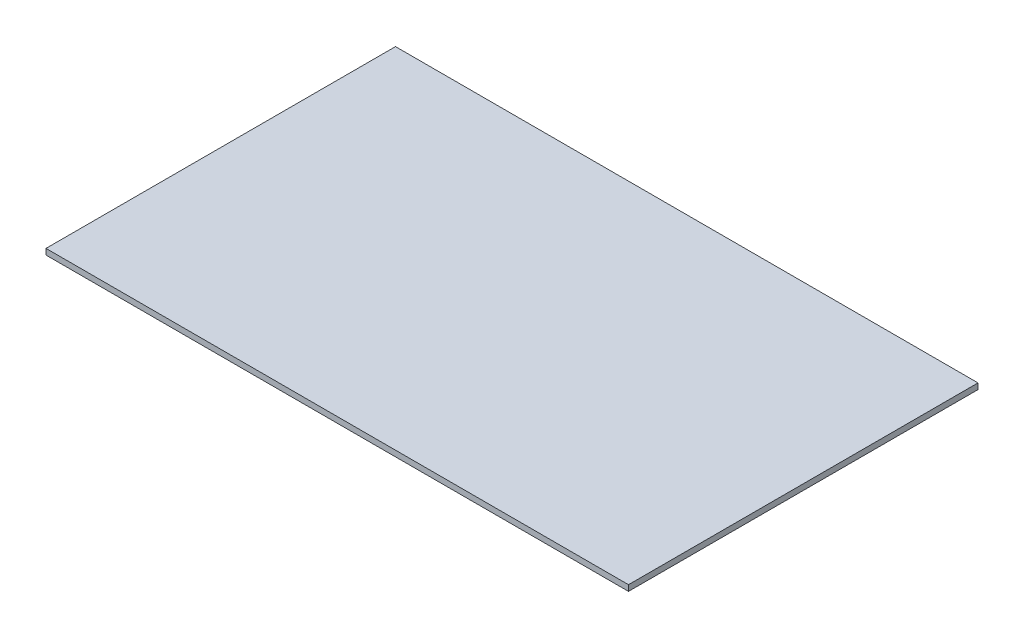
ISO-10303-21;
HEADER;
FILE_DESCRIPTION(('STEP AP214'),'2;1');
FILE_NAME('part.step','',(''),(''),'','','');
FILE_SCHEMA(('AUTOMOTIVE_DESIGN { 1 0 10303 214 1 1 1 1 }'));
ENDSEC;
DATA;
#1=APPLICATION_CONTEXT('core data for automotive mechanical design processes');
#2=APPLICATION_PROTOCOL_DEFINITION('international standard','automotive_design',2000,#1);
#3=PRODUCT_CONTEXT('',#1,'mechanical');
#4=PRODUCT('Part','Part','',(#3));
#5=PRODUCT_RELATED_PRODUCT_CATEGORY('part','',(#4));
#6=PRODUCT_DEFINITION_FORMATION('','',#4);
#7=PRODUCT_DEFINITION_CONTEXT('part definition',#1,'design');
#8=PRODUCT_DEFINITION('design','',#6,#7);
#9=PRODUCT_DEFINITION_SHAPE('','',#8);
#10=(LENGTH_UNIT() NAMED_UNIT(*) SI_UNIT(.MILLI.,.METRE.));
#11=(NAMED_UNIT(*) PLANE_ANGLE_UNIT() SI_UNIT($,.RADIAN.));
#12=(NAMED_UNIT(*) SI_UNIT($,.STERADIAN.) SOLID_ANGLE_UNIT());
#13=UNCERTAINTY_MEASURE_WITH_UNIT(LENGTH_MEASURE(1.E-05),#10,'distance_accuracy_value','');
#14=(GEOMETRIC_REPRESENTATION_CONTEXT(3) GLOBAL_UNCERTAINTY_ASSIGNED_CONTEXT((#13)) GLOBAL_UNIT_ASSIGNED_CONTEXT((#10,
#11,#12)) REPRESENTATION_CONTEXT('',''));
#15=CARTESIAN_POINT('',(0.,0.,0.));
#16=DIRECTION('',(0.,0.,1.));
#17=DIRECTION('',(1.,0.,0.));
#18=AXIS2_PLACEMENT_3D('',#15,#16,#17);
#19=CARTESIAN_POINT('',(-250.,5.,150.));
#20=DIRECTION('',(1.,0.,0.));
#21=DIRECTION('',(0.,0.,-1.));
#22=AXIS2_PLACEMENT_3D('',#19,#20,#21);
#23=PLANE('',#22);
#24=DIRECTION('',(0.,0.,1.));
#25=VECTOR('',#24,1.);
#26=CARTESIAN_POINT('',(-250.,0.,150.));
#27=LINE('',#26,#25);
#28=CARTESIAN_POINT('',(-250.,0.,-150.));
#29=VERTEX_POINT('',#28);
#30=CARTESIAN_POINT('',(-250.,0.,150.));
#31=VERTEX_POINT('',#30);
#32=EDGE_CURVE('E111',#29,#31,#27,.T.);
#33=ORIENTED_EDGE('',*,*,#32,.T.);
#34=DIRECTION('',(0.,-1.,0.));
#35=VECTOR('',#34,1.);
#36=CARTESIAN_POINT('',(-250.,5.,150.));
#37=LINE('',#36,#35);
#38=CARTESIAN_POINT('',(-250.,5.,150.));
#39=VERTEX_POINT('',#38);
#40=EDGE_CURVE('E11',#39,#31,#37,.T.);
#41=ORIENTED_EDGE('',*,*,#40,.F.);
#42=DIRECTION('',(0.,0.,1.));
#43=VECTOR('',#42,1.);
#44=CARTESIAN_POINT('',(-250.,5.,150.));
#45=LINE('',#44,#43);
#46=CARTESIAN_POINT('',(-250.,5.,-150.));
#47=VERTEX_POINT('',#46);
#48=EDGE_CURVE('E95',#47,#39,#45,.T.);
#49=ORIENTED_EDGE('',*,*,#48,.F.);
#50=DIRECTION('',(0.,-1.,0.));
#51=VECTOR('',#50,1.);
#52=CARTESIAN_POINT('',(-250.,5.,-150.));
#53=LINE('',#52,#51);
#54=EDGE_CURVE('E107',#47,#29,#53,.T.);
#55=ORIENTED_EDGE('',*,*,#54,.T.);
#56=EDGE_LOOP('',(#33,#41,#49,#55));
#57=FACE_BOUND('',#56,.T.);
#58=ADVANCED_FACE('F43',(#57),#23,.F.);
#59=CARTESIAN_POINT('',(250.,5.,150.));
#60=DIRECTION('',(0.,0.,-1.));
#61=DIRECTION('',(-1.,0.,0.));
#62=AXIS2_PLACEMENT_3D('',#59,#60,#61);
#63=PLANE('',#62);
#64=DIRECTION('',(1.,0.,0.));
#65=VECTOR('',#64,1.);
#66=CARTESIAN_POINT('',(250.,0.,150.));
#67=LINE('',#66,#65);
#68=CARTESIAN_POINT('',(250.,0.,150.));
#69=VERTEX_POINT('',#68);
#70=EDGE_CURVE('E100',#31,#69,#67,.T.);
#71=ORIENTED_EDGE('',*,*,#70,.T.);
#72=DIRECTION('',(0.,-1.,0.));
#73=VECTOR('',#72,1.);
#74=CARTESIAN_POINT('',(250.,5.,150.));
#75=LINE('',#74,#73);
#76=CARTESIAN_POINT('',(250.,5.,150.));
#77=VERTEX_POINT('',#76);
#78=EDGE_CURVE('E52',#77,#69,#75,.T.);
#79=ORIENTED_EDGE('',*,*,#78,.F.);
#80=DIRECTION('',(1.,0.,0.));
#81=VECTOR('',#80,1.);
#82=CARTESIAN_POINT('',(250.,5.,150.));
#83=LINE('',#82,#81);
#84=EDGE_CURVE('E90',#39,#77,#83,.T.);
#85=ORIENTED_EDGE('',*,*,#84,.F.);
#86=ORIENTED_EDGE('',*,*,#40,.T.);
#87=EDGE_LOOP('',(#71,#79,#85,#86));
#88=FACE_BOUND('',#87,.T.);
#89=ADVANCED_FACE('F99',(#88),#63,.F.);
#90=CARTESIAN_POINT('',(250.,5.,150.));
#91=DIRECTION('',(-1.,0.,0.));
#92=DIRECTION('',(0.,0.,1.));
#93=AXIS2_PLACEMENT_3D('',#90,#91,#92);
#94=PLANE('',#93);
#95=DIRECTION('',(0.,0.,-1.));
#96=VECTOR('',#95,1.);
#97=CARTESIAN_POINT('',(250.,0.,150.));
#98=LINE('',#97,#96);
#99=CARTESIAN_POINT('',(250.,0.,-150.));
#100=VERTEX_POINT('',#99);
#101=EDGE_CURVE('E77',#69,#100,#98,.T.);
#102=ORIENTED_EDGE('',*,*,#101,.T.);
#103=DIRECTION('',(0.,-1.,0.));
#104=VECTOR('',#103,1.);
#105=CARTESIAN_POINT('',(250.,5.,-150.));
#106=LINE('',#105,#104);
#107=CARTESIAN_POINT('',(250.,5.,-150.));
#108=VERTEX_POINT('',#107);
#109=EDGE_CURVE('E102',#108,#100,#106,.T.);
#110=ORIENTED_EDGE('',*,*,#109,.F.);
#111=DIRECTION('',(0.,0.,-1.));
#112=VECTOR('',#111,1.);
#113=CARTESIAN_POINT('',(250.,5.,150.));
#114=LINE('',#113,#112);
#115=EDGE_CURVE('E93',#77,#108,#114,.T.);
#116=ORIENTED_EDGE('',*,*,#115,.F.);
#117=ORIENTED_EDGE('',*,*,#78,.T.);
#118=EDGE_LOOP('',(#102,#110,#116,#117));
#119=FACE_BOUND('',#118,.T.);
#120=ADVANCED_FACE('F103',(#119),#94,.F.);
#121=CARTESIAN_POINT('',(250.,5.,-150.));
#122=DIRECTION('',(0.,0.,1.));
#123=DIRECTION('',(1.,0.,0.));
#124=AXIS2_PLACEMENT_3D('',#121,#122,#123);
#125=PLANE('',#124);
#126=DIRECTION('',(-1.,0.,0.));
#127=VECTOR('',#126,1.);
#128=CARTESIAN_POINT('',(250.,0.,-150.));
#129=LINE('',#128,#127);
#130=EDGE_CURVE('E83',#100,#29,#129,.T.);
#131=ORIENTED_EDGE('',*,*,#130,.T.);
#132=ORIENTED_EDGE('',*,*,#54,.F.);
#133=DIRECTION('',(-1.,0.,0.));
#134=VECTOR('',#133,1.);
#135=CARTESIAN_POINT('',(250.,5.,-150.));
#136=LINE('',#135,#134);
#137=EDGE_CURVE('E60',#108,#47,#136,.T.);
#138=ORIENTED_EDGE('',*,*,#137,.F.);
#139=ORIENTED_EDGE('',*,*,#109,.T.);
#140=EDGE_LOOP('',(#131,#132,#138,#139));
#141=FACE_BOUND('',#140,.T.);
#142=ADVANCED_FACE('F124',(#141),#125,.F.);
#143=CARTESIAN_POINT('',(0.,5.,0.));
#144=DIRECTION('',(0.,1.,0.));
#145=DIRECTION('',(0.,0.,1.));
#146=AXIS2_PLACEMENT_3D('',#143,#144,#145);
#147=PLANE('',#146);
#148=ORIENTED_EDGE('',*,*,#48,.T.);
#149=ORIENTED_EDGE('',*,*,#84,.T.);
#150=ORIENTED_EDGE('',*,*,#115,.T.);
#151=ORIENTED_EDGE('',*,*,#137,.T.);
#152=EDGE_LOOP('',(#148,#149,#150,#151));
#153=FACE_BOUND('',#152,.T.);
#154=ADVANCED_FACE('F91',(#153),#147,.T.);
#155=CARTESIAN_POINT('',(0.,0.,0.));
#156=DIRECTION('',(0.,1.,0.));
#157=DIRECTION('',(0.,0.,1.));
#158=AXIS2_PLACEMENT_3D('',#155,#156,#157);
#159=PLANE('',#158);
#160=ORIENTED_EDGE('',*,*,#32,.F.);
#161=ORIENTED_EDGE('',*,*,#130,.F.);
#162=ORIENTED_EDGE('',*,*,#101,.F.);
#163=ORIENTED_EDGE('',*,*,#70,.F.);
#164=EDGE_LOOP('',(#160,#161,#162,#163));
#165=FACE_BOUND('',#164,.T.);
#166=ADVANCED_FACE('F127',(#165),#159,.F.);
#167=CLOSED_SHELL('',(#58,#89,#120,#142,#154,#166));
#168=MANIFOLD_SOLID_BREP('B2',#167);
#169=ADVANCED_BREP_SHAPE_REPRESENTATION('',(#18,#168),#14);
#170=SHAPE_DEFINITION_REPRESENTATION(#9,#169);
ENDSEC;
END-ISO-10303-21;
